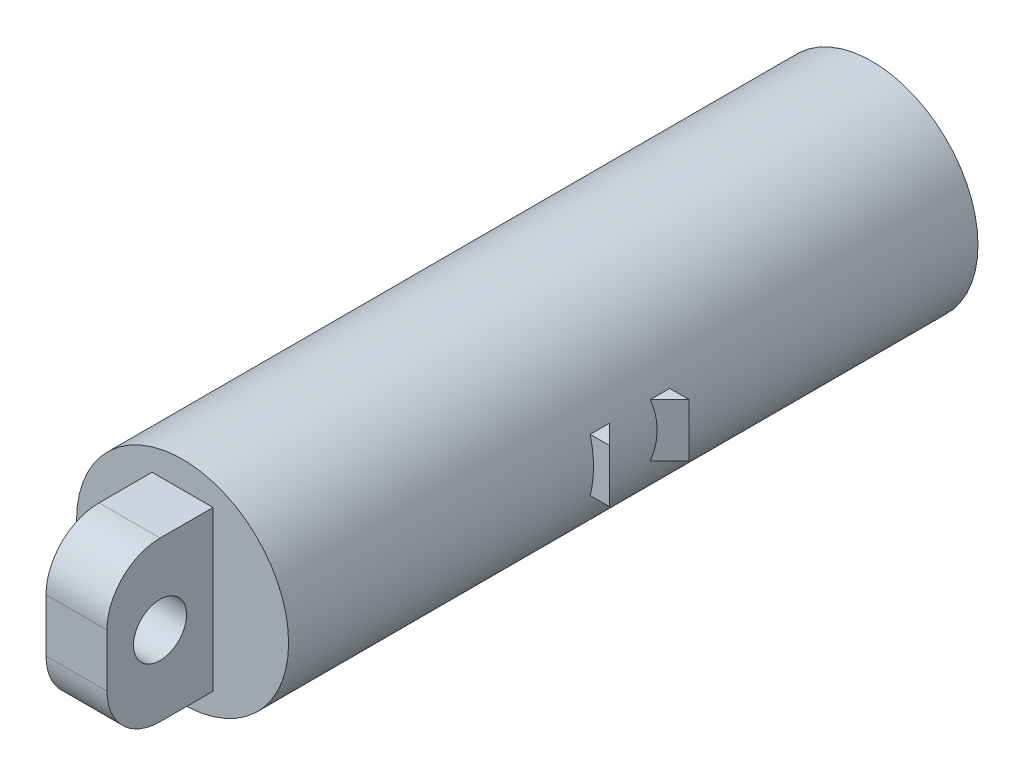
ISO-10303-21;
HEADER;
FILE_DESCRIPTION(('STEP AP214'),'2;1');
FILE_NAME('part.step','',(''),(''),'','','');
FILE_SCHEMA(('AUTOMOTIVE_DESIGN { 1 0 10303 214 1 1 1 1 }'));
ENDSEC;
DATA;
#1=APPLICATION_CONTEXT('core data for automotive mechanical design processes');
#2=APPLICATION_PROTOCOL_DEFINITION('international standard','automotive_design',2000,#1);
#3=PRODUCT_CONTEXT('',#1,'mechanical');
#4=PRODUCT('Part','Part','',(#3));
#5=PRODUCT_RELATED_PRODUCT_CATEGORY('part','',(#4));
#6=PRODUCT_DEFINITION_FORMATION('','',#4);
#7=PRODUCT_DEFINITION_CONTEXT('part definition',#1,'design');
#8=PRODUCT_DEFINITION('design','',#6,#7);
#9=PRODUCT_DEFINITION_SHAPE('','',#8);
#10=(LENGTH_UNIT() NAMED_UNIT(*) SI_UNIT(.MILLI.,.METRE.));
#11=(NAMED_UNIT(*) PLANE_ANGLE_UNIT() SI_UNIT($,.RADIAN.));
#12=(NAMED_UNIT(*) SI_UNIT($,.STERADIAN.) SOLID_ANGLE_UNIT());
#13=UNCERTAINTY_MEASURE_WITH_UNIT(LENGTH_MEASURE(1.E-05),#10,'distance_accuracy_value','');
#14=(GEOMETRIC_REPRESENTATION_CONTEXT(3) GLOBAL_UNCERTAINTY_ASSIGNED_CONTEXT((#13)) GLOBAL_UNIT_ASSIGNED_CONTEXT((#10,
#11,#12)) REPRESENTATION_CONTEXT('',''));
#15=CARTESIAN_POINT('',(0.,0.,0.));
#16=DIRECTION('',(0.,0.,1.));
#17=DIRECTION('',(1.,0.,0.));
#18=AXIS2_PLACEMENT_3D('',#15,#16,#17);
#19=CARTESIAN_POINT('',(0.,0.,130.));
#20=DIRECTION('',(0.,0.,1.));
#21=DIRECTION('',(1.,0.,0.));
#22=AXIS2_PLACEMENT_3D('',#19,#20,#21);
#23=PLANE('',#22);
#24=CARTESIAN_POINT('',(0.,0.,130.));
#25=DIRECTION('',(0.,0.,1.));
#26=DIRECTION('',(1.,0.,0.));
#27=AXIS2_PLACEMENT_3D('',#24,#25,#26);
#28=CIRCLE('',#27,20.);
#29=CARTESIAN_POINT('',(20.,0.,130.));
#30=VERTEX_POINT('',#29);
#31=EDGE_CURVE('E203',#30,#30,#28,.T.);
#32=ORIENTED_EDGE('',*,*,#31,.T.);
#33=EDGE_LOOP('',(#32));
#34=FACE_BOUND('',#33,.T.);
#35=DIRECTION('',(1.,0.,0.));
#36=VECTOR('',#35,1.);
#37=CARTESIAN_POINT('',(5.75,-15.,130.));
#38=LINE('',#37,#36);
#39=CARTESIAN_POINT('',(-5.75,-15.,130.));
#40=VERTEX_POINT('',#39);
#41=CARTESIAN_POINT('',(5.75,-15.,130.));
#42=VERTEX_POINT('',#41);
#43=EDGE_CURVE('E142',#40,#42,#38,.T.);
#44=ORIENTED_EDGE('',*,*,#43,.F.);
#45=DIRECTION('',(0.,-1.,0.));
#46=VECTOR('',#45,1.);
#47=CARTESIAN_POINT('',(-5.75,15.,130.));
#48=LINE('',#47,#46);
#49=CARTESIAN_POINT('',(-5.75,15.,130.));
#50=VERTEX_POINT('',#49);
#51=EDGE_CURVE('E151',#50,#40,#48,.T.);
#52=ORIENTED_EDGE('',*,*,#51,.F.);
#53=DIRECTION('',(-1.,0.,0.));
#54=VECTOR('',#53,1.);
#55=CARTESIAN_POINT('',(5.75,15.,130.));
#56=LINE('',#55,#54);
#57=CARTESIAN_POINT('',(5.75,15.,130.));
#58=VERTEX_POINT('',#57);
#59=EDGE_CURVE('E163',#58,#50,#56,.T.);
#60=ORIENTED_EDGE('',*,*,#59,.F.);
#61=DIRECTION('',(0.,1.,0.));
#62=VECTOR('',#61,1.);
#63=CARTESIAN_POINT('',(5.75,15.,130.));
#64=LINE('',#63,#62);
#65=EDGE_CURVE('E161',#42,#58,#64,.T.);
#66=ORIENTED_EDGE('',*,*,#65,.F.);
#67=EDGE_LOOP('',(#44,#52,#60,#66));
#68=FACE_BOUND('',#67,.T.);
#69=ADVANCED_FACE('F48',(#34,#68),#23,.T.);
#70=CARTESIAN_POINT('',(0.,0.,130.));
#71=DIRECTION('',(0.,0.,-1.));
#72=DIRECTION('',(-1.,0.,0.));
#73=AXIS2_PLACEMENT_3D('',#70,#71,#72);
#74=CYLINDRICAL_SURFACE('',#73,20.);
#75=CARTESIAN_POINT('',(0.,0.,72.5));
#76=DIRECTION('',(0.,0.,-1.));
#77=DIRECTION('',(-1.,0.,0.));
#78=AXIS2_PLACEMENT_3D('',#75,#76,#77);
#79=CIRCLE('',#78,20.);
#80=CARTESIAN_POINT('',(19.3649167310371,5.,72.5));
#81=VERTEX_POINT('',#80);
#82=CARTESIAN_POINT('',(19.3649167310371,-5.,72.5));
#83=VERTEX_POINT('',#82);
#84=EDGE_CURVE('E224',#81,#83,#79,.T.);
#85=ORIENTED_EDGE('',*,*,#84,.F.);
#86=DIRECTION('',(0.,0.,-1.));
#87=VECTOR('',#86,1.);
#88=CARTESIAN_POINT('',(19.3649167310371,5.,130.));
#89=LINE('',#88,#87);
#90=CARTESIAN_POINT('',(19.3649167310371,5.,68.8649167310371));
#91=VERTEX_POINT('',#90);
#92=EDGE_CURVE('E220',#81,#91,#89,.T.);
#93=ORIENTED_EDGE('',*,*,#92,.T.);
#94=CARTESIAN_POINT('',(0.,0.,49.5));
#95=DIRECTION('',(-0.707106781186548,0.,0.707106781186547));
#96=DIRECTION('',(-0.707106781186547,0.,-0.707106781186548));
#97=AXIS2_PLACEMENT_3D('',#94,#95,#96);
#98=ELLIPSE('',#97,28.2842712474619,20.);
#99=CARTESIAN_POINT('',(19.3649167310371,-5.,68.8649167310371));
#100=VERTEX_POINT('',#99);
#101=EDGE_CURVE('E221',#100,#91,#98,.T.);
#102=ORIENTED_EDGE('',*,*,#101,.F.);
#103=DIRECTION('',(0.,0.,-1.));
#104=VECTOR('',#103,1.);
#105=CARTESIAN_POINT('',(19.3649167310371,-5.,130.));
#106=LINE('',#105,#104);
#107=EDGE_CURVE('E212',#83,#100,#106,.T.);
#108=ORIENTED_EDGE('',*,*,#107,.F.);
#109=EDGE_LOOP('',(#85,#93,#102,#108));
#110=FACE_BOUND('',#109,.T.);
#111=CARTESIAN_POINT('',(0.,0.,80.5));
#112=DIRECTION('',(-0.707106781186548,0.,-0.707106781186548));
#113=DIRECTION('',(0.707106781186548,0.,-0.707106781186548));
#114=AXIS2_PLACEMENT_3D('',#111,#112,#113);
#115=ELLIPSE('',#114,28.2842712474619,20.);
#116=CARTESIAN_POINT('',(19.3649167310371,5.,61.1350832689629));
#117=VERTEX_POINT('',#116);
#118=CARTESIAN_POINT('',(19.3649167310371,-5.,61.1350832689629));
#119=VERTEX_POINT('',#118);
#120=EDGE_CURVE('E215',#117,#119,#115,.T.);
#121=ORIENTED_EDGE('',*,*,#120,.F.);
#122=CARTESIAN_POINT('',(19.3649167310371,5.,57.5));
#123=VERTEX_POINT('',#122);
#124=EDGE_CURVE('E218',#117,#123,#89,.T.);
#125=ORIENTED_EDGE('',*,*,#124,.T.);
#126=CARTESIAN_POINT('',(0.,0.,57.5));
#127=DIRECTION('',(0.,0.,1.));
#128=DIRECTION('',(1.,0.,0.));
#129=AXIS2_PLACEMENT_3D('',#126,#127,#128);
#130=CIRCLE('',#129,20.);
#131=CARTESIAN_POINT('',(19.3649167310371,-5.,57.5));
#132=VERTEX_POINT('',#131);
#133=EDGE_CURVE('E211',#132,#123,#130,.T.);
#134=ORIENTED_EDGE('',*,*,#133,.F.);
#135=EDGE_CURVE('E206',#119,#132,#106,.T.);
#136=ORIENTED_EDGE('',*,*,#135,.F.);
#137=EDGE_LOOP('',(#121,#125,#134,#136));
#138=FACE_BOUND('',#137,.T.);
#139=ORIENTED_EDGE('',*,*,#31,.F.);
#140=EDGE_LOOP('',(#139));
#141=FACE_BOUND('',#140,.T.);
#142=CARTESIAN_POINT('',(0.,0.,0.));
#143=DIRECTION('',(0.,0.,1.));
#144=DIRECTION('',(1.,0.,0.));
#145=AXIS2_PLACEMENT_3D('',#142,#143,#144);
#146=CIRCLE('',#145,20.);
#147=CARTESIAN_POINT('',(20.,0.,0.));
#148=VERTEX_POINT('',#147);
#149=EDGE_CURVE('E202',#148,#148,#146,.T.);
#150=ORIENTED_EDGE('',*,*,#149,.T.);
#151=EDGE_LOOP('',(#150));
#152=FACE_BOUND('',#151,.T.);
#153=ADVANCED_FACE('F272',(#110,#138,#141,#152),#74,.T.);
#154=CARTESIAN_POINT('',(0.,0.,0.));
#155=DIRECTION('',(0.,0.,1.));
#156=DIRECTION('',(1.,0.,0.));
#157=AXIS2_PLACEMENT_3D('',#154,#155,#156);
#158=PLANE('',#157);
#159=CARTESIAN_POINT('',(0.,0.,0.));
#160=DIRECTION('',(0.,0.,1.));
#161=DIRECTION('',(1.,0.,0.));
#162=AXIS2_PLACEMENT_3D('',#159,#160,#161);
#163=CIRCLE('',#162,5.);
#164=CARTESIAN_POINT('',(5.,0.,0.));
#165=VERTEX_POINT('',#164);
#166=EDGE_CURVE('E227',#165,#165,#163,.F.);
#167=ORIENTED_EDGE('',*,*,#166,.F.);
#168=EDGE_LOOP('',(#167));
#169=FACE_BOUND('',#168,.T.);
#170=ORIENTED_EDGE('',*,*,#149,.F.);
#171=EDGE_LOOP('',(#170));
#172=FACE_BOUND('',#171,.T.);
#173=ADVANCED_FACE('F278',(#169,#172),#158,.F.);
#174=CARTESIAN_POINT('',(0.,5.,0.));
#175=DIRECTION('',(0.,1.,0.));
#176=DIRECTION('',(0.,0.,1.));
#177=AXIS2_PLACEMENT_3D('',#174,#175,#176);
#178=PLANE('',#177);
#179=ORIENTED_EDGE('',*,*,#124,.F.);
#180=DIRECTION('',(0.707106781186547,0.,-0.707106781186547));
#181=VECTOR('',#180,1.);
#182=CARTESIAN_POINT('',(15.5,5.,65.));
#183=LINE('',#182,#181);
#184=CARTESIAN_POINT('',(23.,5.,57.5));
#185=VERTEX_POINT('',#184);
#186=EDGE_CURVE('E183',#117,#185,#183,.T.);
#187=ORIENTED_EDGE('',*,*,#186,.T.);
#188=DIRECTION('',(-1.,0.,0.));
#189=VECTOR('',#188,1.);
#190=CARTESIAN_POINT('',(23.,5.,57.5));
#191=LINE('',#190,#189);
#192=EDGE_CURVE('E185',#185,#123,#191,.T.);
#193=ORIENTED_EDGE('',*,*,#192,.T.);
#194=EDGE_LOOP('',(#179,#187,#193));
#195=FACE_BOUND('',#194,.T.);
#196=ADVANCED_FACE('F286',(#195),#178,.T.);
#197=CARTESIAN_POINT('',(0.,-5.,0.));
#198=DIRECTION('',(0.,1.,0.));
#199=DIRECTION('',(0.,0.,1.));
#200=AXIS2_PLACEMENT_3D('',#197,#198,#199);
#201=PLANE('',#200);
#202=DIRECTION('',(0.707106781186547,0.,-0.707106781186547));
#203=VECTOR('',#202,1.);
#204=CARTESIAN_POINT('',(15.5,-5.,65.));
#205=LINE('',#204,#203);
#206=CARTESIAN_POINT('',(23.,-5.,57.5));
#207=VERTEX_POINT('',#206);
#208=EDGE_CURVE('E193',#119,#207,#205,.T.);
#209=ORIENTED_EDGE('',*,*,#208,.F.);
#210=ORIENTED_EDGE('',*,*,#135,.T.);
#211=DIRECTION('',(-1.,0.,0.));
#212=VECTOR('',#211,1.);
#213=CARTESIAN_POINT('',(23.,-5.,57.5));
#214=LINE('',#213,#212);
#215=EDGE_CURVE('E180',#207,#132,#214,.T.);
#216=ORIENTED_EDGE('',*,*,#215,.F.);
#217=EDGE_LOOP('',(#209,#210,#216));
#218=FACE_BOUND('',#217,.T.);
#219=ADVANCED_FACE('F321',(#218),#201,.F.);
#220=CARTESIAN_POINT('',(23.,5.,57.5));
#221=DIRECTION('',(0.,0.,1.));
#222=DIRECTION('',(1.,0.,0.));
#223=AXIS2_PLACEMENT_3D('',#220,#221,#222);
#224=PLANE('',#223);
#225=ORIENTED_EDGE('',*,*,#215,.T.);
#226=ORIENTED_EDGE('',*,*,#133,.T.);
#227=ORIENTED_EDGE('',*,*,#192,.F.);
#228=DIRECTION('',(0.,-1.,0.));
#229=VECTOR('',#228,1.);
#230=CARTESIAN_POINT('',(23.,5.,57.5));
#231=LINE('',#230,#229);
#232=EDGE_CURVE('E188',#185,#207,#231,.T.);
#233=ORIENTED_EDGE('',*,*,#232,.T.);
#234=EDGE_LOOP('',(#225,#226,#227,#233));
#235=FACE_BOUND('',#234,.T.);
#236=ADVANCED_FACE('F322',(#235),#224,.F.);
#237=CARTESIAN_POINT('',(15.5,5.,65.));
#238=DIRECTION('',(-0.707106781186548,0.,-0.707106781186548));
#239=DIRECTION('',(-0.707106781186548,0.,0.707106781186548));
#240=AXIS2_PLACEMENT_3D('',#237,#238,#239);
#241=PLANE('',#240);
#242=ORIENTED_EDGE('',*,*,#186,.F.);
#243=ORIENTED_EDGE('',*,*,#120,.T.);
#244=ORIENTED_EDGE('',*,*,#208,.T.);
#245=ORIENTED_EDGE('',*,*,#232,.F.);
#246=EDGE_LOOP('',(#242,#243,#244,#245));
#247=FACE_BOUND('',#246,.T.);
#248=ADVANCED_FACE('F316',(#247),#241,.F.);
#249=ORIENTED_EDGE('',*,*,#92,.F.);
#250=DIRECTION('',(1.,0.,0.));
#251=VECTOR('',#250,1.);
#252=CARTESIAN_POINT('',(23.,5.,72.5));
#253=LINE('',#252,#251);
#254=CARTESIAN_POINT('',(23.,5.,72.5));
#255=VERTEX_POINT('',#254);
#256=EDGE_CURVE('E177',#81,#255,#253,.T.);
#257=ORIENTED_EDGE('',*,*,#256,.T.);
#258=DIRECTION('',(-0.707106781186547,0.,-0.707106781186548));
#259=VECTOR('',#258,1.);
#260=CARTESIAN_POINT('',(23.,5.,72.5));
#261=LINE('',#260,#259);
#262=EDGE_CURVE('E179',#255,#91,#261,.T.);
#263=ORIENTED_EDGE('',*,*,#262,.T.);
#264=EDGE_LOOP('',(#249,#257,#263));
#265=FACE_BOUND('',#264,.T.);
#266=ADVANCED_FACE('F312',(#265),#178,.T.);
#267=DIRECTION('',(1.,0.,0.));
#268=VECTOR('',#267,1.);
#269=CARTESIAN_POINT('',(23.,-5.,72.5));
#270=LINE('',#269,#268);
#271=CARTESIAN_POINT('',(23.,-5.,72.5));
#272=VERTEX_POINT('',#271);
#273=EDGE_CURVE('E176',#83,#272,#270,.T.);
#274=ORIENTED_EDGE('',*,*,#273,.F.);
#275=ORIENTED_EDGE('',*,*,#107,.T.);
#276=DIRECTION('',(-0.707106781186547,0.,-0.707106781186548));
#277=VECTOR('',#276,1.);
#278=CARTESIAN_POINT('',(23.,-5.,72.5));
#279=LINE('',#278,#277);
#280=EDGE_CURVE('E190',#272,#100,#279,.T.);
#281=ORIENTED_EDGE('',*,*,#280,.F.);
#282=EDGE_LOOP('',(#274,#275,#281));
#283=FACE_BOUND('',#282,.T.);
#284=ADVANCED_FACE('F315',(#283),#201,.F.);
#285=CARTESIAN_POINT('',(23.,5.,72.5));
#286=DIRECTION('',(0.,0.,-1.));
#287=DIRECTION('',(-1.,0.,0.));
#288=AXIS2_PLACEMENT_3D('',#285,#286,#287);
#289=PLANE('',#288);
#290=ORIENTED_EDGE('',*,*,#256,.F.);
#291=ORIENTED_EDGE('',*,*,#84,.T.);
#292=ORIENTED_EDGE('',*,*,#273,.T.);
#293=DIRECTION('',(0.,-1.,0.));
#294=VECTOR('',#293,1.);
#295=CARTESIAN_POINT('',(23.,5.,72.5));
#296=LINE('',#295,#294);
#297=EDGE_CURVE('E199',#255,#272,#296,.T.);
#298=ORIENTED_EDGE('',*,*,#297,.F.);
#299=EDGE_LOOP('',(#290,#291,#292,#298));
#300=FACE_BOUND('',#299,.T.);
#301=ADVANCED_FACE('F283',(#300),#289,.F.);
#302=CARTESIAN_POINT('',(23.,5.,72.5));
#303=DIRECTION('',(-0.707106781186548,0.,0.707106781186547));
#304=DIRECTION('',(0.707106781186547,0.,0.707106781186548));
#305=AXIS2_PLACEMENT_3D('',#302,#303,#304);
#306=PLANE('',#305);
#307=ORIENTED_EDGE('',*,*,#280,.T.);
#308=ORIENTED_EDGE('',*,*,#101,.T.);
#309=ORIENTED_EDGE('',*,*,#262,.F.);
#310=ORIENTED_EDGE('',*,*,#297,.T.);
#311=EDGE_LOOP('',(#307,#308,#309,#310));
#312=FACE_BOUND('',#311,.T.);
#313=ADVANCED_FACE('F310',(#312),#306,.F.);
#314=CARTESIAN_POINT('',(0.,0.,-10.));
#315=DIRECTION('',(0.,0.,1.));
#316=DIRECTION('',(1.,0.,0.));
#317=AXIS2_PLACEMENT_3D('',#314,#315,#316);
#318=CYLINDRICAL_SURFACE('',#317,5.);
#319=CARTESIAN_POINT('',(0.,0.,-10.));
#320=DIRECTION('',(0.,0.,-1.));
#321=DIRECTION('',(-1.,0.,0.));
#322=AXIS2_PLACEMENT_3D('',#319,#320,#321);
#323=CIRCLE('',#322,5.);
#324=CARTESIAN_POINT('',(-5.,0.,-10.));
#325=VERTEX_POINT('',#324);
#326=EDGE_CURVE('E147',#325,#325,#323,.T.);
#327=ORIENTED_EDGE('',*,*,#326,.F.);
#328=EDGE_LOOP('',(#327));
#329=FACE_BOUND('',#328,.T.);
#330=ORIENTED_EDGE('',*,*,#166,.T.);
#331=EDGE_LOOP('',(#330));
#332=FACE_BOUND('',#331,.T.);
#333=ADVANCED_FACE('F306',(#329,#332),#318,.T.);
#334=CARTESIAN_POINT('',(0.,0.,-10.));
#335=DIRECTION('',(0.,0.,-1.));
#336=DIRECTION('',(-1.,0.,0.));
#337=AXIS2_PLACEMENT_3D('',#334,#335,#336);
#338=PLANE('',#337);
#339=ORIENTED_EDGE('',*,*,#326,.T.);
#340=EDGE_LOOP('',(#339));
#341=FACE_BOUND('',#340,.T.);
#342=ADVANCED_FACE('F303',(#341),#338,.T.);
#343=CARTESIAN_POINT('',(-5.75,15.,150.));
#344=DIRECTION('',(1.,0.,0.));
#345=DIRECTION('',(0.,1.,0.));
#346=AXIS2_PLACEMENT_3D('',#343,#344,#345);
#347=PLANE('',#346);
#348=CARTESIAN_POINT('',(-5.75,0.,140.));
#349=DIRECTION('',(1.,0.,0.));
#350=DIRECTION('',(0.,1.,0.));
#351=AXIS2_PLACEMENT_3D('',#348,#349,#350);
#352=CIRCLE('',#351,4.99999999999999);
#353=CARTESIAN_POINT('',(-5.75,4.99999999999999,140.));
#354=VERTEX_POINT('',#353);
#355=EDGE_CURVE('E158',#354,#354,#352,.T.);
#356=ORIENTED_EDGE('',*,*,#355,.T.);
#357=EDGE_LOOP('',(#356));
#358=FACE_BOUND('',#357,.T.);
#359=DIRECTION('',(0.,-1.,0.));
#360=VECTOR('',#359,1.);
#361=CARTESIAN_POINT('',(-5.75,15.,150.));
#362=LINE('',#361,#360);
#363=CARTESIAN_POINT('',(-5.75,5.,150.));
#364=VERTEX_POINT('',#363);
#365=CARTESIAN_POINT('',(-5.75,-5.,150.));
#366=VERTEX_POINT('',#365);
#367=EDGE_CURVE('E168',#364,#366,#362,.T.);
#368=ORIENTED_EDGE('',*,*,#367,.F.);
#369=CARTESIAN_POINT('',(-5.75,5.,140.));
#370=DIRECTION('',(1.,0.,0.));
#371=DIRECTION('',(0.,1.,0.));
#372=AXIS2_PLACEMENT_3D('',#369,#370,#371);
#373=CIRCLE('',#372,10.);
#374=CARTESIAN_POINT('',(-5.75,15.,140.));
#375=VERTEX_POINT('',#374);
#376=EDGE_CURVE('E238',#364,#375,#373,.F.);
#377=ORIENTED_EDGE('',*,*,#376,.T.);
#378=DIRECTION('',(0.,0.,-1.));
#379=VECTOR('',#378,1.);
#380=CARTESIAN_POINT('',(-5.75,15.,150.));
#381=LINE('',#380,#379);
#382=EDGE_CURVE('E154',#375,#50,#381,.T.);
#383=ORIENTED_EDGE('',*,*,#382,.T.);
#384=ORIENTED_EDGE('',*,*,#51,.T.);
#385=DIRECTION('',(0.,0.,-1.));
#386=VECTOR('',#385,1.);
#387=CARTESIAN_POINT('',(-5.75,-15.,150.));
#388=LINE('',#387,#386);
#389=CARTESIAN_POINT('',(-5.75,-15.,140.));
#390=VERTEX_POINT('',#389);
#391=EDGE_CURVE('E138',#390,#40,#388,.T.);
#392=ORIENTED_EDGE('',*,*,#391,.F.);
#393=CARTESIAN_POINT('',(-5.75,-5.,140.));
#394=DIRECTION('',(1.,0.,0.));
#395=DIRECTION('',(0.,1.,0.));
#396=AXIS2_PLACEMENT_3D('',#393,#394,#395);
#397=CIRCLE('',#396,10.);
#398=EDGE_CURVE('E236',#390,#366,#397,.F.);
#399=ORIENTED_EDGE('',*,*,#398,.T.);
#400=EDGE_LOOP('',(#368,#377,#383,#384,#392,#399));
#401=FACE_BOUND('',#400,.T.);
#402=ADVANCED_FACE('F153',(#358,#401),#347,.F.);
#403=CARTESIAN_POINT('',(5.75,-15.,150.));
#404=DIRECTION('',(0.,1.,0.));
#405=DIRECTION('',(-1.,0.,0.));
#406=AXIS2_PLACEMENT_3D('',#403,#404,#405);
#407=PLANE('',#406);
#408=DIRECTION('',(0.,0.,-1.));
#409=VECTOR('',#408,1.);
#410=CARTESIAN_POINT('',(5.75,-15.,150.));
#411=LINE('',#410,#409);
#412=CARTESIAN_POINT('',(5.75,-15.,140.));
#413=VERTEX_POINT('',#412);
#414=EDGE_CURVE('E148',#413,#42,#411,.T.);
#415=ORIENTED_EDGE('',*,*,#414,.F.);
#416=DIRECTION('',(1.,0.,0.));
#417=VECTOR('',#416,1.);
#418=CARTESIAN_POINT('',(5.75,-15.,140.));
#419=LINE('',#418,#417);
#420=EDGE_CURVE('E13',#413,#390,#419,.F.);
#421=ORIENTED_EDGE('',*,*,#420,.T.);
#422=ORIENTED_EDGE('',*,*,#391,.T.);
#423=ORIENTED_EDGE('',*,*,#43,.T.);
#424=EDGE_LOOP('',(#415,#421,#422,#423));
#425=FACE_BOUND('',#424,.T.);
#426=ADVANCED_FACE('F140',(#425),#407,.F.);
#427=CARTESIAN_POINT('',(5.75,15.,150.));
#428=DIRECTION('',(-1.,0.,0.));
#429=DIRECTION('',(0.,-1.,0.));
#430=AXIS2_PLACEMENT_3D('',#427,#428,#429);
#431=PLANE('',#430);
#432=CARTESIAN_POINT('',(5.75,0.,140.));
#433=DIRECTION('',(-1.,0.,0.));
#434=DIRECTION('',(0.,-1.,0.));
#435=AXIS2_PLACEMENT_3D('',#432,#433,#434);
#436=CIRCLE('',#435,4.99999999999999);
#437=CARTESIAN_POINT('',(5.75,-4.99999999999999,140.));
#438=VERTEX_POINT('',#437);
#439=EDGE_CURVE('E52',#438,#438,#436,.T.);
#440=ORIENTED_EDGE('',*,*,#439,.T.);
#441=EDGE_LOOP('',(#440));
#442=FACE_BOUND('',#441,.T.);
#443=DIRECTION('',(0.,0.,-1.));
#444=VECTOR('',#443,1.);
#445=CARTESIAN_POINT('',(5.75,15.,150.));
#446=LINE('',#445,#444);
#447=CARTESIAN_POINT('',(5.75,15.,140.));
#448=VERTEX_POINT('',#447);
#449=EDGE_CURVE('E170',#448,#58,#446,.T.);
#450=ORIENTED_EDGE('',*,*,#449,.F.);
#451=CARTESIAN_POINT('',(5.75,5.,140.));
#452=DIRECTION('',(-1.,0.,0.));
#453=DIRECTION('',(0.,-1.,0.));
#454=AXIS2_PLACEMENT_3D('',#451,#452,#453);
#455=CIRCLE('',#454,10.);
#456=CARTESIAN_POINT('',(5.75,5.,150.));
#457=VERTEX_POINT('',#456);
#458=EDGE_CURVE('E57',#448,#457,#455,.F.);
#459=ORIENTED_EDGE('',*,*,#458,.T.);
#460=DIRECTION('',(0.,1.,0.));
#461=VECTOR('',#460,1.);
#462=CARTESIAN_POINT('',(5.75,15.,150.));
#463=LINE('',#462,#461);
#464=CARTESIAN_POINT('',(5.75,-5.,150.));
#465=VERTEX_POINT('',#464);
#466=EDGE_CURVE('E171',#465,#457,#463,.T.);
#467=ORIENTED_EDGE('',*,*,#466,.F.);
#468=CARTESIAN_POINT('',(5.75,-5.,140.));
#469=DIRECTION('',(-1.,0.,0.));
#470=DIRECTION('',(0.,-1.,0.));
#471=AXIS2_PLACEMENT_3D('',#468,#469,#470);
#472=CIRCLE('',#471,10.);
#473=EDGE_CURVE('E64',#465,#413,#472,.F.);
#474=ORIENTED_EDGE('',*,*,#473,.T.);
#475=ORIENTED_EDGE('',*,*,#414,.T.);
#476=ORIENTED_EDGE('',*,*,#65,.T.);
#477=EDGE_LOOP('',(#450,#459,#467,#474,#475,#476));
#478=FACE_BOUND('',#477,.T.);
#479=ADVANCED_FACE('F244',(#442,#478),#431,.F.);
#480=CARTESIAN_POINT('',(5.75,15.,150.));
#481=DIRECTION('',(0.,-1.,0.));
#482=DIRECTION('',(1.,0.,0.));
#483=AXIS2_PLACEMENT_3D('',#480,#481,#482);
#484=PLANE('',#483);
#485=ORIENTED_EDGE('',*,*,#382,.F.);
#486=DIRECTION('',(-1.,0.,0.));
#487=VECTOR('',#486,1.);
#488=CARTESIAN_POINT('',(5.75,15.,140.));
#489=LINE('',#488,#487);
#490=EDGE_CURVE('E72',#375,#448,#489,.F.);
#491=ORIENTED_EDGE('',*,*,#490,.T.);
#492=ORIENTED_EDGE('',*,*,#449,.T.);
#493=ORIENTED_EDGE('',*,*,#59,.T.);
#494=EDGE_LOOP('',(#485,#491,#492,#493));
#495=FACE_BOUND('',#494,.T.);
#496=ADVANCED_FACE('F252',(#495),#484,.F.);
#497=CARTESIAN_POINT('',(0.,0.,150.));
#498=DIRECTION('',(0.,0.,-1.));
#499=DIRECTION('',(-1.,0.,0.));
#500=AXIS2_PLACEMENT_3D('',#497,#498,#499);
#501=PLANE('',#500);
#502=ORIENTED_EDGE('',*,*,#466,.T.);
#503=DIRECTION('',(-1.,0.,0.));
#504=VECTOR('',#503,1.);
#505=CARTESIAN_POINT('',(0.,5.,150.));
#506=LINE('',#505,#504);
#507=EDGE_CURVE('E233',#457,#364,#506,.T.);
#508=ORIENTED_EDGE('',*,*,#507,.T.);
#509=ORIENTED_EDGE('',*,*,#367,.T.);
#510=DIRECTION('',(1.,0.,0.));
#511=VECTOR('',#510,1.);
#512=CARTESIAN_POINT('',(0.,-5.,150.));
#513=LINE('',#512,#511);
#514=EDGE_CURVE('E230',#366,#465,#513,.T.);
#515=ORIENTED_EDGE('',*,*,#514,.T.);
#516=EDGE_LOOP('',(#502,#508,#509,#515));
#517=FACE_BOUND('',#516,.T.);
#518=ADVANCED_FACE('F248',(#517),#501,.F.);
#519=CARTESIAN_POINT('',(0.,5.,140.));
#520=DIRECTION('',(-1.,0.,0.));
#521=DIRECTION('',(0.,-1.,0.));
#522=AXIS2_PLACEMENT_3D('',#519,#520,#521);
#523=CYLINDRICAL_SURFACE('',#522,10.);
#524=ORIENTED_EDGE('',*,*,#458,.F.);
#525=ORIENTED_EDGE('',*,*,#490,.F.);
#526=ORIENTED_EDGE('',*,*,#376,.F.);
#527=ORIENTED_EDGE('',*,*,#507,.F.);
#528=EDGE_LOOP('',(#524,#525,#526,#527));
#529=FACE_BOUND('',#528,.T.);
#530=ADVANCED_FACE('F251',(#529),#523,.T.);
#531=CARTESIAN_POINT('',(0.,-5.,140.));
#532=DIRECTION('',(1.,0.,0.));
#533=DIRECTION('',(0.,1.,0.));
#534=AXIS2_PLACEMENT_3D('',#531,#532,#533);
#535=CYLINDRICAL_SURFACE('',#534,10.);
#536=ORIENTED_EDGE('',*,*,#398,.F.);
#537=ORIENTED_EDGE('',*,*,#420,.F.);
#538=ORIENTED_EDGE('',*,*,#473,.F.);
#539=ORIENTED_EDGE('',*,*,#514,.F.);
#540=EDGE_LOOP('',(#536,#537,#538,#539));
#541=FACE_BOUND('',#540,.T.);
#542=ADVANCED_FACE('F50',(#541),#535,.T.);
#543=CARTESIAN_POINT('',(-20.,0.,140.));
#544=DIRECTION('',(1.,0.,0.));
#545=DIRECTION('',(0.,1.,0.));
#546=AXIS2_PLACEMENT_3D('',#543,#544,#545);
#547=CYLINDRICAL_SURFACE('',#546,4.99999999999999);
#548=ORIENTED_EDGE('',*,*,#439,.F.);
#549=EDGE_LOOP('',(#548));
#550=FACE_BOUND('',#549,.T.);
#551=ORIENTED_EDGE('',*,*,#355,.F.);
#552=EDGE_LOOP('',(#551));
#553=FACE_BOUND('',#552,.T.);
#554=ADVANCED_FACE('F263',(#550,#553),#547,.F.);
#555=CLOSED_SHELL('',(#69,#153,#173,#196,#219,#236,#248,#266,#284,#301,#313,#333,#342,#402,#426,
#479,#496,#518,#530,#542,#554));
#556=MANIFOLD_SOLID_BREP('B2',#555);
#557=ADVANCED_BREP_SHAPE_REPRESENTATION('',(#18,#556),#14);
#558=SHAPE_DEFINITION_REPRESENTATION(#9,#557);
ENDSEC;
END-ISO-10303-21;
